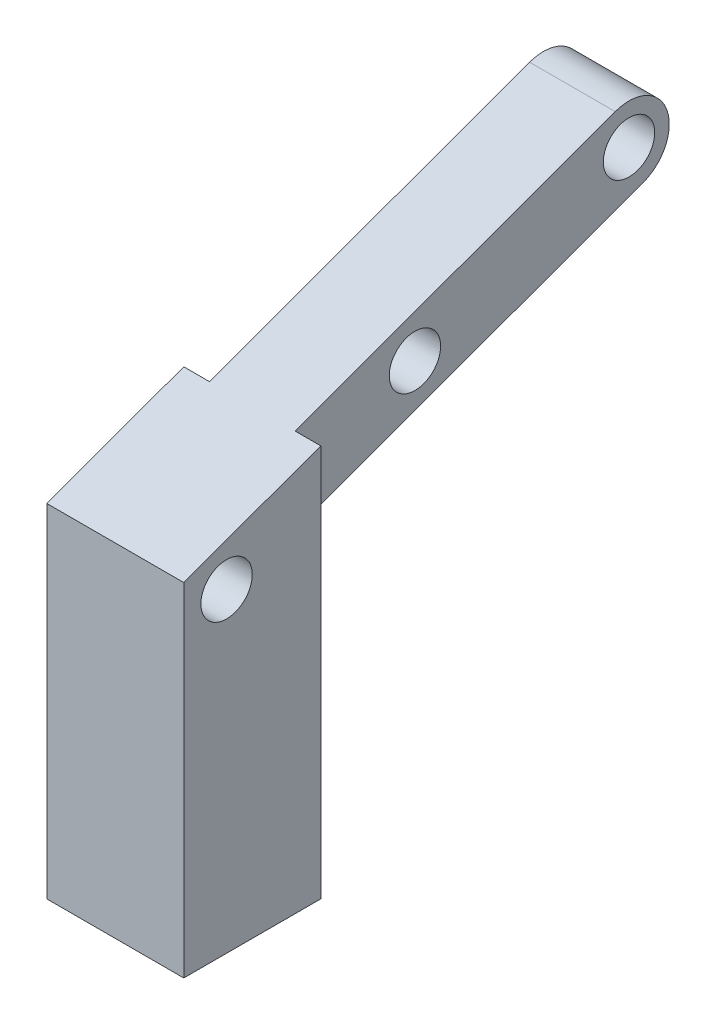
ISO-10303-21;
HEADER;
FILE_DESCRIPTION(('STEP AP214'),'2;1');
FILE_NAME('part.step','',(''),(''),'','','');
FILE_SCHEMA(('AUTOMOTIVE_DESIGN { 1 0 10303 214 1 1 1 1 }'));
ENDSEC;
DATA;
#1=APPLICATION_CONTEXT('core data for automotive mechanical design processes');
#2=APPLICATION_PROTOCOL_DEFINITION('international standard','automotive_design',2000,#1);
#3=PRODUCT_CONTEXT('',#1,'mechanical');
#4=PRODUCT('Part','Part','',(#3));
#5=PRODUCT_RELATED_PRODUCT_CATEGORY('part','',(#4));
#6=PRODUCT_DEFINITION_FORMATION('','',#4);
#7=PRODUCT_DEFINITION_CONTEXT('part definition',#1,'design');
#8=PRODUCT_DEFINITION('design','',#6,#7);
#9=PRODUCT_DEFINITION_SHAPE('','',#8);
#10=(LENGTH_UNIT() NAMED_UNIT(*) SI_UNIT(.MILLI.,.METRE.));
#11=(NAMED_UNIT(*) PLANE_ANGLE_UNIT() SI_UNIT($,.RADIAN.));
#12=(NAMED_UNIT(*) SI_UNIT($,.STERADIAN.) SOLID_ANGLE_UNIT());
#13=UNCERTAINTY_MEASURE_WITH_UNIT(LENGTH_MEASURE(1.E-05),#10,'distance_accuracy_value','');
#14=(GEOMETRIC_REPRESENTATION_CONTEXT(3) GLOBAL_UNCERTAINTY_ASSIGNED_CONTEXT((#13)) GLOBAL_UNIT_ASSIGNED_CONTEXT((#10,
#11,#12)) REPRESENTATION_CONTEXT('',''));
#15=CARTESIAN_POINT('',(0.,0.,0.));
#16=DIRECTION('',(0.,0.,1.));
#17=DIRECTION('',(1.,0.,0.));
#18=AXIS2_PLACEMENT_3D('',#15,#16,#17);
#19=CARTESIAN_POINT('',(2.5,15.,4.));
#20=DIRECTION('',(0.,0.93969262078591,0.342020143325663));
#21=DIRECTION('',(0.,-0.342020143325663,0.939692620785911));
#22=AXIS2_PLACEMENT_3D('',#19,#20,#21);
#23=PLANE('',#22);
#24=DIRECTION('',(-1.,0.,0.));
#25=VECTOR('',#24,1.);
#26=CARTESIAN_POINT('',(4.,25.3016258884216,-24.3034845121082));
#27=LINE('',#26,#25);
#28=CARTESIAN_POINT('',(2.5,25.3016258884216,-24.3034845121082));
#29=VERTEX_POINT('',#28);
#30=CARTESIAN_POINT('',(-2.5,25.3016258884216,-24.3034845121082));
#31=VERTEX_POINT('',#30);
#32=EDGE_CURVE('E226',#29,#31,#27,.T.);
#33=ORIENTED_EDGE('',*,*,#32,.F.);
#34=DIRECTION('',(0.,0.342020143325663,-0.93969262078591));
#35=VECTOR('',#34,1.);
#36=CARTESIAN_POINT('',(2.5,15.,4.));
#37=LINE('',#36,#35);
#38=CARTESIAN_POINT('',(2.5,17.9117618741296,-4.));
#39=VERTEX_POINT('',#38);
#40=EDGE_CURVE('E246',#39,#29,#37,.T.);
#41=ORIENTED_EDGE('',*,*,#40,.F.);
#42=DIRECTION('',(-1.,0.,0.));
#43=VECTOR('',#42,1.);
#44=CARTESIAN_POINT('',(4.,17.9117618741296,-4.));
#45=LINE('',#44,#43);
#46=CARTESIAN_POINT('',(-2.5,17.9117618741296,-4.));
#47=VERTEX_POINT('',#46);
#48=EDGE_CURVE('E50',#39,#47,#45,.T.);
#49=ORIENTED_EDGE('',*,*,#48,.T.);
#50=DIRECTION('',(0.,0.342020143325663,-0.93969262078591));
#51=VECTOR('',#50,1.);
#52=CARTESIAN_POINT('',(-2.5,15.,4.));
#53=LINE('',#52,#51);
#54=EDGE_CURVE('E245',#47,#31,#53,.T.);
#55=ORIENTED_EDGE('',*,*,#54,.T.);
#56=EDGE_LOOP('',(#33,#41,#49,#55));
#57=FACE_BOUND('',#56,.T.);
#58=ADVANCED_FACE('F41',(#57),#23,.F.);
#59=CARTESIAN_POINT('',(2.5,0.,0.));
#60=DIRECTION('',(1.,0.,0.));
#61=DIRECTION('',(0.,0.,-1.));
#62=AXIS2_PLACEMENT_3D('',#59,#60,#61);
#63=PLANE('',#62);
#64=DIRECTION('',(0.,-0.342020143325663,0.93969262078591));
#65=VECTOR('',#64,1.);
#66=CARTESIAN_POINT('',(2.5,20.,4.));
#67=LINE('',#66,#65);
#68=CARTESIAN_POINT('',(2.5,29.7167369962191,-22.6965154878918));
#69=VERTEX_POINT('',#68);
#70=CARTESIAN_POINT('',(2.5,22.9117618741296,-4.));
#71=VERTEX_POINT('',#70);
#72=EDGE_CURVE('E249',#69,#71,#67,.T.);
#73=ORIENTED_EDGE('',*,*,#72,.T.);
#74=DIRECTION('',(0.,1.,0.));
#75=VECTOR('',#74,1.);
#76=CARTESIAN_POINT('',(2.5,20.,-4.));
#77=LINE('',#76,#75);
#78=EDGE_CURVE('E66',#39,#71,#77,.T.);
#79=ORIENTED_EDGE('',*,*,#78,.F.);
#80=ORIENTED_EDGE('',*,*,#40,.T.);
#81=CARTESIAN_POINT('',(2.5,27.5091814423204,-23.5));
#82=DIRECTION('',(1.,0.,0.));
#83=DIRECTION('',(0.,0.,-1.));
#84=AXIS2_PLACEMENT_3D('',#81,#82,#83);
#85=CIRCLE('',#84,2.34923155196478);
#86=EDGE_CURVE('E228',#29,#69,#85,.T.);
#87=ORIENTED_EDGE('',*,*,#86,.T.);
#88=EDGE_LOOP('',(#73,#79,#80,#87));
#89=FACE_BOUND('',#88,.T.);
#90=CARTESIAN_POINT('',(2.5,27.5091814423204,-23.5));
#91=DIRECTION('',(1.,0.,0.));
#92=DIRECTION('',(0.,0.,-1.));
#93=AXIS2_PLACEMENT_3D('',#90,#91,#92);
#94=CIRCLE('',#93,1.5);
#95=CARTESIAN_POINT('',(2.5,27.5091814423204,-25.));
#96=VERTEX_POINT('',#95);
#97=EDGE_CURVE('E242',#96,#96,#94,.T.);
#98=ORIENTED_EDGE('',*,*,#97,.F.);
#99=EDGE_LOOP('',(#98));
#100=FACE_BOUND('',#99,.T.);
#101=CARTESIAN_POINT('',(2.5,22.9595535139929,-11.));
#102=DIRECTION('',(1.,0.,0.));
#103=DIRECTION('',(0.,0.,-1.));
#104=AXIS2_PLACEMENT_3D('',#101,#102,#103);
#105=CIRCLE('',#104,1.5);
#106=CARTESIAN_POINT('',(2.5,22.9595535139929,-12.5));
#107=VERTEX_POINT('',#106);
#108=EDGE_CURVE('E238',#107,#107,#105,.T.);
#109=ORIENTED_EDGE('',*,*,#108,.F.);
#110=EDGE_LOOP('',(#109));
#111=FACE_BOUND('',#110,.T.);
#112=ADVANCED_FACE('F306',(#89,#100,#111),#63,.T.);
#113=CARTESIAN_POINT('',(-2.5,0.,0.));
#114=DIRECTION('',(1.,0.,0.));
#115=DIRECTION('',(0.,0.,-1.));
#116=AXIS2_PLACEMENT_3D('',#113,#114,#115);
#117=PLANE('',#116);
#118=CARTESIAN_POINT('',(-2.5,22.9595535139929,-11.));
#119=DIRECTION('',(1.,0.,0.));
#120=DIRECTION('',(0.,0.,-1.));
#121=AXIS2_PLACEMENT_3D('',#118,#119,#120);
#122=CIRCLE('',#121,1.5);
#123=CARTESIAN_POINT('',(-2.5,22.9595535139929,-12.5));
#124=VERTEX_POINT('',#123);
#125=EDGE_CURVE('E237',#124,#124,#122,.T.);
#126=ORIENTED_EDGE('',*,*,#125,.T.);
#127=EDGE_LOOP('',(#126));
#128=FACE_BOUND('',#127,.T.);
#129=CARTESIAN_POINT('',(-2.5,27.5091814423204,-23.5));
#130=DIRECTION('',(1.,0.,0.));
#131=DIRECTION('',(0.,0.,-1.));
#132=AXIS2_PLACEMENT_3D('',#129,#130,#131);
#133=CIRCLE('',#132,1.5);
#134=CARTESIAN_POINT('',(-2.5,27.5091814423204,-25.));
#135=VERTEX_POINT('',#134);
#136=EDGE_CURVE('E241',#135,#135,#133,.T.);
#137=ORIENTED_EDGE('',*,*,#136,.T.);
#138=EDGE_LOOP('',(#137));
#139=FACE_BOUND('',#138,.T.);
#140=DIRECTION('',(0.,1.,0.));
#141=VECTOR('',#140,1.);
#142=CARTESIAN_POINT('',(-2.5,20.,-4.));
#143=LINE('',#142,#141);
#144=CARTESIAN_POINT('',(-2.5,22.9117618741296,-4.));
#145=VERTEX_POINT('',#144);
#146=EDGE_CURVE('E58',#47,#145,#143,.T.);
#147=ORIENTED_EDGE('',*,*,#146,.T.);
#148=DIRECTION('',(0.,-0.342020143325663,0.93969262078591));
#149=VECTOR('',#148,1.);
#150=CARTESIAN_POINT('',(-2.5,20.,4.));
#151=LINE('',#150,#149);
#152=CARTESIAN_POINT('',(-2.5,29.7167369962191,-22.6965154878918));
#153=VERTEX_POINT('',#152);
#154=EDGE_CURVE('E250',#153,#145,#151,.T.);
#155=ORIENTED_EDGE('',*,*,#154,.F.);
#156=CARTESIAN_POINT('',(-2.5,27.5091814423204,-23.5));
#157=DIRECTION('',(-1.,0.,0.));
#158=DIRECTION('',(0.,0.,1.));
#159=AXIS2_PLACEMENT_3D('',#156,#157,#158);
#160=CIRCLE('',#159,2.34923155196478);
#161=EDGE_CURVE('E221',#153,#31,#160,.T.);
#162=ORIENTED_EDGE('',*,*,#161,.T.);
#163=ORIENTED_EDGE('',*,*,#54,.F.);
#164=EDGE_LOOP('',(#147,#155,#162,#163));
#165=FACE_BOUND('',#164,.T.);
#166=ADVANCED_FACE('F312',(#128,#139,#165),#117,.F.);
#167=CARTESIAN_POINT('',(-4.,20.,4.));
#168=DIRECTION('',(1.,0.,0.));
#169=DIRECTION('',(0.,0.,-1.));
#170=AXIS2_PLACEMENT_3D('',#167,#168,#169);
#171=PLANE('',#170);
#172=CARTESIAN_POINT('',(-4.,18.4099255856655,1.5));
#173=DIRECTION('',(1.,0.,0.));
#174=DIRECTION('',(0.,0.,-1.));
#175=AXIS2_PLACEMENT_3D('',#172,#173,#174);
#176=CIRCLE('',#175,1.5);
#177=CARTESIAN_POINT('',(-4.,18.4099255856655,0.));
#178=VERTEX_POINT('',#177);
#179=EDGE_CURVE('E234',#178,#178,#176,.T.);
#180=ORIENTED_EDGE('',*,*,#179,.T.);
#181=EDGE_LOOP('',(#180));
#182=FACE_BOUND('',#181,.T.);
#183=DIRECTION('',(0.,0.,1.));
#184=VECTOR('',#183,1.);
#185=CARTESIAN_POINT('',(-4.,0.,4.));
#186=LINE('',#185,#184);
#187=CARTESIAN_POINT('',(-4.,0.,-4.));
#188=VERTEX_POINT('',#187);
#189=CARTESIAN_POINT('',(-4.,0.,4.));
#190=VERTEX_POINT('',#189);
#191=EDGE_CURVE('E257',#188,#190,#186,.T.);
#192=ORIENTED_EDGE('',*,*,#191,.T.);
#193=DIRECTION('',(0.,-1.,0.));
#194=VECTOR('',#193,1.);
#195=CARTESIAN_POINT('',(-4.,20.,4.));
#196=LINE('',#195,#194);
#197=CARTESIAN_POINT('',(-4.,20.,4.));
#198=VERTEX_POINT('',#197);
#199=EDGE_CURVE('E277',#198,#190,#196,.T.);
#200=ORIENTED_EDGE('',*,*,#199,.F.);
#201=DIRECTION('',(0.,0.342020143325663,-0.939692620785911));
#202=VECTOR('',#201,1.);
#203=CARTESIAN_POINT('',(-4.,18.9460196505629,6.89578721062732));
#204=LINE('',#203,#202);
#205=CARTESIAN_POINT('',(-4.,22.9117618741296,-4.));
#206=VERTEX_POINT('',#205);
#207=EDGE_CURVE('E214',#198,#206,#204,.T.);
#208=ORIENTED_EDGE('',*,*,#207,.T.);
#209=DIRECTION('',(0.,-1.,0.));
#210=VECTOR('',#209,1.);
#211=CARTESIAN_POINT('',(-4.,20.,-4.));
#212=LINE('',#211,#210);
#213=EDGE_CURVE('E260',#206,#188,#212,.T.);
#214=ORIENTED_EDGE('',*,*,#213,.T.);
#215=EDGE_LOOP('',(#192,#200,#208,#214));
#216=FACE_BOUND('',#215,.T.);
#217=ADVANCED_FACE('F43',(#182,#216),#171,.F.);
#218=CARTESIAN_POINT('',(4.,20.,4.));
#219=DIRECTION('',(0.,0.,-1.));
#220=DIRECTION('',(-1.,0.,0.));
#221=AXIS2_PLACEMENT_3D('',#218,#219,#220);
#222=PLANE('',#221);
#223=DIRECTION('',(0.,-1.,0.));
#224=VECTOR('',#223,1.);
#225=CARTESIAN_POINT('',(4.,20.,4.));
#226=LINE('',#225,#224);
#227=CARTESIAN_POINT('',(4.,20.,4.));
#228=VERTEX_POINT('',#227);
#229=CARTESIAN_POINT('',(4.,0.,4.));
#230=VERTEX_POINT('',#229);
#231=EDGE_CURVE('E274',#228,#230,#226,.T.);
#232=ORIENTED_EDGE('',*,*,#231,.F.);
#233=DIRECTION('',(1.,0.,0.));
#234=VECTOR('',#233,1.);
#235=CARTESIAN_POINT('',(4.,20.,4.));
#236=LINE('',#235,#234);
#237=EDGE_CURVE('E258',#198,#228,#236,.T.);
#238=ORIENTED_EDGE('',*,*,#237,.F.);
#239=ORIENTED_EDGE('',*,*,#199,.T.);
#240=DIRECTION('',(1.,0.,0.));
#241=VECTOR('',#240,1.);
#242=CARTESIAN_POINT('',(4.,0.,4.));
#243=LINE('',#242,#241);
#244=EDGE_CURVE('E264',#190,#230,#243,.T.);
#245=ORIENTED_EDGE('',*,*,#244,.T.);
#246=EDGE_LOOP('',(#232,#238,#239,#245));
#247=FACE_BOUND('',#246,.T.);
#248=ADVANCED_FACE('F329',(#247),#222,.F.);
#249=CARTESIAN_POINT('',(4.,20.,4.));
#250=DIRECTION('',(-1.,0.,0.));
#251=DIRECTION('',(0.,0.,1.));
#252=AXIS2_PLACEMENT_3D('',#249,#250,#251);
#253=PLANE('',#252);
#254=CARTESIAN_POINT('',(4.,18.4099255856655,1.5));
#255=DIRECTION('',(1.,0.,0.));
#256=DIRECTION('',(0.,0.,-1.));
#257=AXIS2_PLACEMENT_3D('',#254,#255,#256);
#258=CIRCLE('',#257,1.5);
#259=CARTESIAN_POINT('',(4.,18.4099255856655,0.));
#260=VERTEX_POINT('',#259);
#261=EDGE_CURVE('E231',#260,#260,#258,.T.);
#262=ORIENTED_EDGE('',*,*,#261,.F.);
#263=EDGE_LOOP('',(#262));
#264=FACE_BOUND('',#263,.T.);
#265=DIRECTION('',(0.,0.,-1.));
#266=VECTOR('',#265,1.);
#267=CARTESIAN_POINT('',(4.,0.,4.));
#268=LINE('',#267,#266);
#269=CARTESIAN_POINT('',(4.,0.,-4.));
#270=VERTEX_POINT('',#269);
#271=EDGE_CURVE('E266',#230,#270,#268,.T.);
#272=ORIENTED_EDGE('',*,*,#271,.T.);
#273=DIRECTION('',(0.,-1.,0.));
#274=VECTOR('',#273,1.);
#275=CARTESIAN_POINT('',(4.,20.,-4.));
#276=LINE('',#275,#274);
#277=CARTESIAN_POINT('',(4.,22.9117618741296,-4.));
#278=VERTEX_POINT('',#277);
#279=EDGE_CURVE('E271',#278,#270,#276,.T.);
#280=ORIENTED_EDGE('',*,*,#279,.F.);
#281=DIRECTION('',(0.,-0.342020143325663,0.939692620785911));
#282=VECTOR('',#281,1.);
#283=CARTESIAN_POINT('',(4.,18.9460196505629,6.89578721062733));
#284=LINE('',#283,#282);
#285=EDGE_CURVE('E207',#278,#228,#284,.T.);
#286=ORIENTED_EDGE('',*,*,#285,.T.);
#287=ORIENTED_EDGE('',*,*,#231,.T.);
#288=EDGE_LOOP('',(#272,#280,#286,#287));
#289=FACE_BOUND('',#288,.T.);
#290=ADVANCED_FACE('F327',(#264,#289),#253,.F.);
#291=CARTESIAN_POINT('',(4.,20.,-4.));
#292=DIRECTION('',(0.,0.,1.));
#293=DIRECTION('',(1.,0.,0.));
#294=AXIS2_PLACEMENT_3D('',#291,#292,#293);
#295=PLANE('',#294);
#296=ORIENTED_EDGE('',*,*,#48,.F.);
#297=ORIENTED_EDGE('',*,*,#78,.T.);
#298=DIRECTION('',(1.,0.,0.));
#299=VECTOR('',#298,1.);
#300=CARTESIAN_POINT('',(-12.5134221798073,22.9117618741296,-4.));
#301=LINE('',#300,#299);
#302=EDGE_CURVE('E210',#71,#278,#301,.T.);
#303=ORIENTED_EDGE('',*,*,#302,.T.);
#304=ORIENTED_EDGE('',*,*,#279,.T.);
#305=DIRECTION('',(-1.,0.,0.));
#306=VECTOR('',#305,1.);
#307=CARTESIAN_POINT('',(4.,0.,-4.));
#308=LINE('',#307,#306);
#309=EDGE_CURVE('E261',#270,#188,#308,.T.);
#310=ORIENTED_EDGE('',*,*,#309,.T.);
#311=ORIENTED_EDGE('',*,*,#213,.F.);
#312=EDGE_CURVE('E211',#206,#145,#301,.T.);
#313=ORIENTED_EDGE('',*,*,#312,.T.);
#314=ORIENTED_EDGE('',*,*,#146,.F.);
#315=EDGE_LOOP('',(#296,#297,#303,#304,#310,#311,#313,#314));
#316=FACE_BOUND('',#315,.T.);
#317=ADVANCED_FACE('F323',(#316),#295,.F.);
#318=CARTESIAN_POINT('',(0.,0.,0.));
#319=DIRECTION('',(0.,1.,0.));
#320=DIRECTION('',(0.,0.,1.));
#321=AXIS2_PLACEMENT_3D('',#318,#319,#320);
#322=PLANE('',#321);
#323=CARTESIAN_POINT('',(0.,0.,0.));
#324=DIRECTION('',(0.,-1.,0.));
#325=DIRECTION('',(0.,0.,-1.));
#326=AXIS2_PLACEMENT_3D('',#323,#324,#325);
#327=CIRCLE('',#326,1.3);
#328=CARTESIAN_POINT('',(0.,0.,-1.3));
#329=VERTEX_POINT('',#328);
#330=EDGE_CURVE('E217',#329,#329,#327,.T.);
#331=ORIENTED_EDGE('',*,*,#330,.F.);
#332=EDGE_LOOP('',(#331));
#333=FACE_BOUND('',#332,.T.);
#334=ORIENTED_EDGE('',*,*,#191,.F.);
#335=ORIENTED_EDGE('',*,*,#309,.F.);
#336=ORIENTED_EDGE('',*,*,#271,.F.);
#337=ORIENTED_EDGE('',*,*,#244,.F.);
#338=EDGE_LOOP('',(#334,#335,#336,#337));
#339=FACE_BOUND('',#338,.T.);
#340=ADVANCED_FACE('F320',(#333,#339),#322,.F.);
#341=CARTESIAN_POINT('',(2.5,20.,4.));
#342=DIRECTION('',(0.,-0.93969262078591,-0.342020143325663));
#343=DIRECTION('',(0.,0.342020143325663,-0.939692620785911));
#344=AXIS2_PLACEMENT_3D('',#341,#342,#343);
#345=PLANE('',#344);
#346=ORIENTED_EDGE('',*,*,#154,.T.);
#347=ORIENTED_EDGE('',*,*,#312,.F.);
#348=ORIENTED_EDGE('',*,*,#207,.F.);
#349=ORIENTED_EDGE('',*,*,#237,.T.);
#350=ORIENTED_EDGE('',*,*,#285,.F.);
#351=ORIENTED_EDGE('',*,*,#302,.F.);
#352=ORIENTED_EDGE('',*,*,#72,.F.);
#353=DIRECTION('',(-1.,0.,0.));
#354=VECTOR('',#353,1.);
#355=CARTESIAN_POINT('',(4.,29.7167369962191,-22.6965154878918));
#356=LINE('',#355,#354);
#357=EDGE_CURVE('E11',#69,#153,#356,.T.);
#358=ORIENTED_EDGE('',*,*,#357,.T.);
#359=EDGE_LOOP('',(#346,#347,#348,#349,#350,#351,#352,#358));
#360=FACE_BOUND('',#359,.T.);
#361=ADVANCED_FACE('F318',(#360),#345,.F.);
#362=CARTESIAN_POINT('',(-4.,22.9595535139929,-11.));
#363=DIRECTION('',(1.,0.,0.));
#364=DIRECTION('',(0.,0.,-1.));
#365=AXIS2_PLACEMENT_3D('',#362,#363,#364);
#366=CYLINDRICAL_SURFACE('',#365,1.5);
#367=CARTESIAN_POINT('',(2.5,22.9595535139929,-12.5));
#368=CARTESIAN_POINT('',(2.44791666666667,22.9595535139929,-12.5));
#369=CARTESIAN_POINT('',(2.39583333333333,22.9595535139929,-12.5));
#370=CARTESIAN_POINT('',(2.29166666666667,22.9595535139929,-12.5));
#371=CARTESIAN_POINT('',(2.23958333333333,22.9595535139929,-12.5));
#372=CARTESIAN_POINT('',(2.13541666666667,22.9595535139929,-12.5));
#373=CARTESIAN_POINT('',(2.08333333333333,22.9595535139929,-12.5));
#374=CARTESIAN_POINT('',(1.97916666666667,22.9595535139929,-12.5));
#375=CARTESIAN_POINT('',(1.92708333333333,22.9595535139929,-12.5));
#376=CARTESIAN_POINT('',(1.82291666666667,22.9595535139929,-12.5));
#377=CARTESIAN_POINT('',(1.77083333333333,22.9595535139929,-12.5));
#378=CARTESIAN_POINT('',(1.66666666666667,22.9595535139929,-12.5));
#379=CARTESIAN_POINT('',(1.61458333333333,22.9595535139929,-12.5));
#380=CARTESIAN_POINT('',(1.51041666666667,22.9595535139929,-12.5));
#381=CARTESIAN_POINT('',(1.45833333333333,22.9595535139929,-12.5));
#382=CARTESIAN_POINT('',(1.35416666666667,22.9595535139929,-12.5));
#383=CARTESIAN_POINT('',(1.30208333333333,22.9595535139929,-12.5));
#384=CARTESIAN_POINT('',(1.19791666666667,22.9595535139929,-12.5));
#385=CARTESIAN_POINT('',(1.14583333333333,22.9595535139929,-12.5));
#386=CARTESIAN_POINT('',(1.04166666666667,22.9595535139929,-12.5));
#387=CARTESIAN_POINT('',(0.989583333333333,22.9595535139929,-12.5));
#388=CARTESIAN_POINT('',(0.885416666666667,22.9595535139929,-12.5));
#389=CARTESIAN_POINT('',(0.833333333333334,22.9595535139929,-12.5));
#390=CARTESIAN_POINT('',(0.729166666666667,22.9595535139929,-12.5));
#391=CARTESIAN_POINT('',(0.677083333333334,22.9595535139929,-12.5));
#392=CARTESIAN_POINT('',(0.572916666666667,22.9595535139929,-12.5));
#393=CARTESIAN_POINT('',(0.520833333333334,22.9595535139929,-12.5));
#394=CARTESIAN_POINT('',(0.416666666666667,22.9595535139929,-12.5));
#395=CARTESIAN_POINT('',(0.364583333333334,22.9595535139929,-12.5));
#396=CARTESIAN_POINT('',(0.260416666666667,22.9595535139929,-12.5));
#397=CARTESIAN_POINT('',(0.208333333333334,22.9595535139929,-12.5));
#398=CARTESIAN_POINT('',(0.104166666666667,22.9595535139929,-12.5));
#399=CARTESIAN_POINT('',(0.0520833333333334,22.9595535139929,-12.5));
#400=CARTESIAN_POINT('',(-0.0520833333333334,22.9595535139929,-12.5));
#401=CARTESIAN_POINT('',(-0.104166666666667,22.9595535139929,-12.5));
#402=CARTESIAN_POINT('',(-0.208333333333334,22.9595535139929,-12.5));
#403=CARTESIAN_POINT('',(-0.260416666666667,22.9595535139929,-12.5));
#404=CARTESIAN_POINT('',(-0.364583333333334,22.9595535139929,-12.5));
#405=CARTESIAN_POINT('',(-0.416666666666667,22.9595535139929,-12.5));
#406=CARTESIAN_POINT('',(-0.520833333333333,22.9595535139929,-12.5));
#407=CARTESIAN_POINT('',(-0.572916666666667,22.9595535139929,-12.5));
#408=CARTESIAN_POINT('',(-0.677083333333333,22.9595535139929,-12.5));
#409=CARTESIAN_POINT('',(-0.729166666666667,22.9595535139929,-12.5));
#410=CARTESIAN_POINT('',(-0.833333333333333,22.9595535139929,-12.5));
#411=CARTESIAN_POINT('',(-0.885416666666667,22.9595535139929,-12.5));
#412=CARTESIAN_POINT('',(-0.989583333333333,22.9595535139929,-12.5));
#413=CARTESIAN_POINT('',(-1.04166666666667,22.9595535139929,-12.5));
#414=CARTESIAN_POINT('',(-1.14583333333333,22.9595535139929,-12.5));
#415=CARTESIAN_POINT('',(-1.19791666666667,22.9595535139929,-12.5));
#416=CARTESIAN_POINT('',(-1.30208333333333,22.9595535139929,-12.5));
#417=CARTESIAN_POINT('',(-1.35416666666667,22.9595535139929,-12.5));
#418=CARTESIAN_POINT('',(-1.45833333333333,22.9595535139929,-12.5));
#419=CARTESIAN_POINT('',(-1.51041666666667,22.9595535139929,-12.5));
#420=CARTESIAN_POINT('',(-1.61458333333333,22.9595535139929,-12.5));
#421=CARTESIAN_POINT('',(-1.66666666666667,22.9595535139929,-12.5));
#422=CARTESIAN_POINT('',(-1.77083333333333,22.9595535139929,-12.5));
#423=CARTESIAN_POINT('',(-1.82291666666667,22.9595535139929,-12.5));
#424=CARTESIAN_POINT('',(-1.92708333333333,22.9595535139929,-12.5));
#425=CARTESIAN_POINT('',(-1.97916666666667,22.9595535139929,-12.5));
#426=CARTESIAN_POINT('',(-2.08333333333333,22.9595535139929,-12.5));
#427=CARTESIAN_POINT('',(-2.13541666666667,22.9595535139929,-12.5));
#428=CARTESIAN_POINT('',(-2.23958333333333,22.9595535139929,-12.5));
#429=CARTESIAN_POINT('',(-2.29166666666667,22.9595535139929,-12.5));
#430=CARTESIAN_POINT('',(-2.39583333333333,22.9595535139929,-12.5));
#431=CARTESIAN_POINT('',(-2.44791666666667,22.9595535139929,-12.5));
#432=CARTESIAN_POINT('',(-2.5,22.9595535139929,-12.5));
#433=B_SPLINE_CURVE_WITH_KNOTS('',3,(#367,#368,#369,#370,#371,#372,#373,#374,#375,#376,#377,
#378,#379,#380,#381,#382,#383,#384,#385,#386,#387,#388,#389,#390,#391,#392,#393,#394,#395,#396,
#397,#398,#399,#400,#401,#402,#403,#404,#405,#406,#407,#408,#409,#410,#411,#412,#413,#414,#415,
#416,#417,#418,#419,#420,#421,#422,#423,#424,#425,#426,#427,#428,#429,#430,#431,#432),
.UNSPECIFIED.,.F.,.F.,(4,2,2,2,2,2,2,2,2,2,2,2,2,2,2,2,2,2,2,2,2,2,2,2,2,2,2,2,2,2,2,2,4),(0.,
0.15625,0.3125,0.46875,0.625000000000001,0.78125,0.9375,1.09375,1.25,1.40625,1.5625,1.71875,
1.875,2.03125,2.1875,2.34375,2.5,2.65625,2.8125,2.96875,3.125,3.28125,3.4375,3.59375,3.75,
3.90625,4.0625,4.21875,4.375,4.53125,4.6875,4.84375,5.),.UNSPECIFIED.);
#434=EDGE_CURVE('BSEAM358',#107,#124,#433,.T.);
#435=ORIENTED_EDGE('',*,*,#108,.T.);
#436=ORIENTED_EDGE('',*,*,#125,.F.);
#437=ORIENTED_EDGE('',*,*,#434,.T.);
#438=ORIENTED_EDGE('',*,*,#434,.F.);
#439=EDGE_LOOP('',(#435,#437,#436,#438));
#440=FACE_BOUND('',#439,.T.);
#441=ADVANCED_FACE('F358',(#440),#366,.F.);
#442=CARTESIAN_POINT('',(-4.,27.5091814423204,-23.5));
#443=DIRECTION('',(1.,0.,0.));
#444=DIRECTION('',(0.,0.,-1.));
#445=AXIS2_PLACEMENT_3D('',#442,#443,#444);
#446=CYLINDRICAL_SURFACE('',#445,1.5);
#447=CARTESIAN_POINT('',(2.5,27.5091814423204,-25.));
#448=CARTESIAN_POINT('',(2.44791666666667,27.5091814423204,-25.));
#449=CARTESIAN_POINT('',(2.39583333333333,27.5091814423204,-25.));
#450=CARTESIAN_POINT('',(2.29166666666667,27.5091814423204,-25.));
#451=CARTESIAN_POINT('',(2.23958333333333,27.5091814423204,-25.));
#452=CARTESIAN_POINT('',(2.13541666666667,27.5091814423204,-25.));
#453=CARTESIAN_POINT('',(2.08333333333333,27.5091814423204,-25.));
#454=CARTESIAN_POINT('',(1.97916666666667,27.5091814423204,-25.));
#455=CARTESIAN_POINT('',(1.92708333333333,27.5091814423204,-25.));
#456=CARTESIAN_POINT('',(1.82291666666667,27.5091814423204,-25.));
#457=CARTESIAN_POINT('',(1.77083333333333,27.5091814423204,-25.));
#458=CARTESIAN_POINT('',(1.66666666666667,27.5091814423204,-25.));
#459=CARTESIAN_POINT('',(1.61458333333333,27.5091814423204,-25.));
#460=CARTESIAN_POINT('',(1.51041666666667,27.5091814423204,-25.));
#461=CARTESIAN_POINT('',(1.45833333333333,27.5091814423204,-25.));
#462=CARTESIAN_POINT('',(1.35416666666667,27.5091814423204,-25.));
#463=CARTESIAN_POINT('',(1.30208333333333,27.5091814423204,-25.));
#464=CARTESIAN_POINT('',(1.19791666666667,27.5091814423204,-25.));
#465=CARTESIAN_POINT('',(1.14583333333333,27.5091814423204,-25.));
#466=CARTESIAN_POINT('',(1.04166666666667,27.5091814423204,-25.));
#467=CARTESIAN_POINT('',(0.989583333333333,27.5091814423204,-25.));
#468=CARTESIAN_POINT('',(0.885416666666667,27.5091814423204,-25.));
#469=CARTESIAN_POINT('',(0.833333333333334,27.5091814423204,-25.));
#470=CARTESIAN_POINT('',(0.729166666666667,27.5091814423204,-25.));
#471=CARTESIAN_POINT('',(0.677083333333334,27.5091814423204,-25.));
#472=CARTESIAN_POINT('',(0.572916666666667,27.5091814423204,-25.));
#473=CARTESIAN_POINT('',(0.520833333333334,27.5091814423204,-25.));
#474=CARTESIAN_POINT('',(0.416666666666667,27.5091814423204,-25.));
#475=CARTESIAN_POINT('',(0.364583333333334,27.5091814423204,-25.));
#476=CARTESIAN_POINT('',(0.260416666666667,27.5091814423204,-25.));
#477=CARTESIAN_POINT('',(0.208333333333334,27.5091814423204,-25.));
#478=CARTESIAN_POINT('',(0.104166666666667,27.5091814423204,-25.));
#479=CARTESIAN_POINT('',(0.0520833333333334,27.5091814423204,-25.));
#480=CARTESIAN_POINT('',(-0.0520833333333334,27.5091814423204,-25.));
#481=CARTESIAN_POINT('',(-0.104166666666667,27.5091814423204,-25.));
#482=CARTESIAN_POINT('',(-0.208333333333334,27.5091814423204,-25.));
#483=CARTESIAN_POINT('',(-0.260416666666667,27.5091814423204,-25.));
#484=CARTESIAN_POINT('',(-0.364583333333334,27.5091814423204,-25.));
#485=CARTESIAN_POINT('',(-0.416666666666667,27.5091814423204,-25.));
#486=CARTESIAN_POINT('',(-0.520833333333333,27.5091814423204,-25.));
#487=CARTESIAN_POINT('',(-0.572916666666667,27.5091814423204,-25.));
#488=CARTESIAN_POINT('',(-0.677083333333333,27.5091814423204,-25.));
#489=CARTESIAN_POINT('',(-0.729166666666667,27.5091814423204,-25.));
#490=CARTESIAN_POINT('',(-0.833333333333333,27.5091814423204,-25.));
#491=CARTESIAN_POINT('',(-0.885416666666667,27.5091814423204,-25.));
#492=CARTESIAN_POINT('',(-0.989583333333333,27.5091814423204,-25.));
#493=CARTESIAN_POINT('',(-1.04166666666667,27.5091814423204,-25.));
#494=CARTESIAN_POINT('',(-1.14583333333333,27.5091814423204,-25.));
#495=CARTESIAN_POINT('',(-1.19791666666667,27.5091814423204,-25.));
#496=CARTESIAN_POINT('',(-1.30208333333333,27.5091814423204,-25.));
#497=CARTESIAN_POINT('',(-1.35416666666667,27.5091814423204,-25.));
#498=CARTESIAN_POINT('',(-1.45833333333333,27.5091814423204,-25.));
#499=CARTESIAN_POINT('',(-1.51041666666667,27.5091814423204,-25.));
#500=CARTESIAN_POINT('',(-1.61458333333333,27.5091814423204,-25.));
#501=CARTESIAN_POINT('',(-1.66666666666667,27.5091814423204,-25.));
#502=CARTESIAN_POINT('',(-1.77083333333333,27.5091814423204,-25.));
#503=CARTESIAN_POINT('',(-1.82291666666667,27.5091814423204,-25.));
#504=CARTESIAN_POINT('',(-1.92708333333333,27.5091814423204,-25.));
#505=CARTESIAN_POINT('',(-1.97916666666667,27.5091814423204,-25.));
#506=CARTESIAN_POINT('',(-2.08333333333333,27.5091814423204,-25.));
#507=CARTESIAN_POINT('',(-2.13541666666667,27.5091814423204,-25.));
#508=CARTESIAN_POINT('',(-2.23958333333333,27.5091814423204,-25.));
#509=CARTESIAN_POINT('',(-2.29166666666667,27.5091814423204,-25.));
#510=CARTESIAN_POINT('',(-2.39583333333333,27.5091814423204,-25.));
#511=CARTESIAN_POINT('',(-2.44791666666667,27.5091814423204,-25.));
#512=CARTESIAN_POINT('',(-2.5,27.5091814423204,-25.));
#513=B_SPLINE_CURVE_WITH_KNOTS('',3,(#447,#448,#449,#450,#451,#452,#453,#454,#455,#456,#457,
#458,#459,#460,#461,#462,#463,#464,#465,#466,#467,#468,#469,#470,#471,#472,#473,#474,#475,#476,
#477,#478,#479,#480,#481,#482,#483,#484,#485,#486,#487,#488,#489,#490,#491,#492,#493,#494,#495,
#496,#497,#498,#499,#500,#501,#502,#503,#504,#505,#506,#507,#508,#509,#510,#511,#512),
.UNSPECIFIED.,.F.,.F.,(4,2,2,2,2,2,2,2,2,2,2,2,2,2,2,2,2,2,2,2,2,2,2,2,2,2,2,2,2,2,2,2,4),(0.,
0.15625,0.3125,0.46875,0.625000000000001,0.78125,0.9375,1.09375,1.25,1.40625,1.5625,1.71875,
1.875,2.03125,2.1875,2.34375,2.5,2.65625,2.8125,2.96875,3.125,3.28125,3.4375,3.59375,3.75,
3.90625,4.0625,4.21875,4.375,4.53125,4.6875,4.84375,5.),.UNSPECIFIED.);
#514=EDGE_CURVE('BSEAM361',#96,#135,#513,.T.);
#515=ORIENTED_EDGE('',*,*,#97,.T.);
#516=ORIENTED_EDGE('',*,*,#136,.F.);
#517=ORIENTED_EDGE('',*,*,#514,.T.);
#518=ORIENTED_EDGE('',*,*,#514,.F.);
#519=EDGE_LOOP('',(#515,#517,#516,#518));
#520=FACE_BOUND('',#519,.T.);
#521=ADVANCED_FACE('F361',(#520),#446,.F.);
#522=CARTESIAN_POINT('',(-4.,18.4099255856655,1.5));
#523=DIRECTION('',(1.,0.,0.));
#524=DIRECTION('',(0.,0.,-1.));
#525=AXIS2_PLACEMENT_3D('',#522,#523,#524);
#526=CYLINDRICAL_SURFACE('',#525,1.5);
#527=ORIENTED_EDGE('',*,*,#179,.F.);
#528=EDGE_LOOP('',(#527));
#529=FACE_BOUND('',#528,.T.);
#530=ORIENTED_EDGE('',*,*,#261,.T.);
#531=EDGE_LOOP('',(#530));
#532=FACE_BOUND('',#531,.T.);
#533=ADVANCED_FACE('F370',(#529,#532),#526,.F.);
#534=CARTESIAN_POINT('',(4.,27.5091814423204,-23.5));
#535=DIRECTION('',(-1.,0.,0.));
#536=DIRECTION('',(0.,0.,1.));
#537=AXIS2_PLACEMENT_3D('',#534,#535,#536);
#538=CYLINDRICAL_SURFACE('',#537,2.34923155196478);
#539=ORIENTED_EDGE('',*,*,#32,.T.);
#540=ORIENTED_EDGE('',*,*,#161,.F.);
#541=ORIENTED_EDGE('',*,*,#357,.F.);
#542=ORIENTED_EDGE('',*,*,#86,.F.);
#543=EDGE_LOOP('',(#539,#540,#541,#542));
#544=FACE_BOUND('',#543,.T.);
#545=ADVANCED_FACE('F304',(#544),#538,.T.);
#546=CARTESIAN_POINT('',(0.,10.,0.));
#547=DIRECTION('',(0.,-1.,0.));
#548=DIRECTION('',(0.,0.,-1.));
#549=AXIS2_PLACEMENT_3D('',#546,#547,#548);
#550=CYLINDRICAL_SURFACE('',#549,1.3);
#551=CARTESIAN_POINT('',(0.,4.,0.));
#552=DIRECTION('',(0.,-1.,0.));
#553=DIRECTION('',(0.,0.,-1.));
#554=AXIS2_PLACEMENT_3D('',#551,#552,#553);
#555=CIRCLE('',#554,1.3);
#556=CARTESIAN_POINT('',(0.,4.,-1.3));
#557=VERTEX_POINT('',#556);
#558=EDGE_CURVE('E199',#557,#557,#555,.F.);
#559=ORIENTED_EDGE('',*,*,#558,.T.);
#560=EDGE_LOOP('',(#559));
#561=FACE_BOUND('',#560,.T.);
#562=ORIENTED_EDGE('',*,*,#330,.T.);
#563=EDGE_LOOP('',(#562));
#564=FACE_BOUND('',#563,.T.);
#565=ADVANCED_FACE('F295',(#561,#564),#550,.F.);
#566=CARTESIAN_POINT('',(0.,7.55,0.));
#567=DIRECTION('',(0.,-1.,0.));
#568=DIRECTION('',(0.,0.,-1.));
#569=AXIS2_PLACEMENT_3D('',#566,#567,#568);
#570=PLANE('',#569);
#571=DIRECTION('',(0.5,0.,0.866025403784439));
#572=VECTOR('',#571,1.);
#573=CARTESIAN_POINT('',(1.42028166220648,7.55,-2.46));
#574=LINE('',#573,#572);
#575=CARTESIAN_POINT('',(1.42028166220648,7.55,-2.46));
#576=VERTEX_POINT('',#575);
#577=CARTESIAN_POINT('',(2.84056332441296,7.55,0.));
#578=VERTEX_POINT('',#577);
#579=EDGE_CURVE('E151',#576,#578,#574,.T.);
#580=ORIENTED_EDGE('',*,*,#579,.T.);
#581=DIRECTION('',(-0.5,0.,0.866025403784438));
#582=VECTOR('',#581,1.);
#583=CARTESIAN_POINT('',(2.84056332441296,7.55,0.));
#584=LINE('',#583,#582);
#585=CARTESIAN_POINT('',(1.42028166220648,7.55,2.46));
#586=VERTEX_POINT('',#585);
#587=EDGE_CURVE('E162',#578,#586,#584,.T.);
#588=ORIENTED_EDGE('',*,*,#587,.T.);
#589=DIRECTION('',(-1.,0.,0.));
#590=VECTOR('',#589,1.);
#591=CARTESIAN_POINT('',(1.42028166220648,7.55,2.46));
#592=LINE('',#591,#590);
#593=CARTESIAN_POINT('',(-1.42028166220648,7.55,2.46));
#594=VERTEX_POINT('',#593);
#595=EDGE_CURVE('E167',#586,#594,#592,.T.);
#596=ORIENTED_EDGE('',*,*,#595,.T.);
#597=DIRECTION('',(-0.5,0.,-0.866025403784439));
#598=VECTOR('',#597,1.);
#599=CARTESIAN_POINT('',(-1.42028166220648,7.55,2.46));
#600=LINE('',#599,#598);
#601=CARTESIAN_POINT('',(-2.84056332441296,7.55,0.));
#602=VERTEX_POINT('',#601);
#603=EDGE_CURVE('E180',#594,#602,#600,.T.);
#604=ORIENTED_EDGE('',*,*,#603,.T.);
#605=DIRECTION('',(0.5,0.,-0.866025403784439));
#606=VECTOR('',#605,1.);
#607=CARTESIAN_POINT('',(-2.84056332441296,7.55,0.));
#608=LINE('',#607,#606);
#609=CARTESIAN_POINT('',(-1.42028166220648,7.55,-2.46));
#610=VERTEX_POINT('',#609);
#611=EDGE_CURVE('E183',#602,#610,#608,.T.);
#612=ORIENTED_EDGE('',*,*,#611,.T.);
#613=DIRECTION('',(1.,0.,0.));
#614=VECTOR('',#613,1.);
#615=CARTESIAN_POINT('',(-1.42028166220648,7.55,-2.46));
#616=LINE('',#615,#614);
#617=EDGE_CURVE('E159',#610,#576,#616,.T.);
#618=ORIENTED_EDGE('',*,*,#617,.T.);
#619=EDGE_LOOP('',(#580,#588,#596,#604,#612,#618));
#620=FACE_BOUND('',#619,.T.);
#621=CARTESIAN_POINT('',(0.,7.55,0.));
#622=DIRECTION('',(0.,-1.,0.));
#623=DIRECTION('',(0.,0.,-1.));
#624=AXIS2_PLACEMENT_3D('',#621,#622,#623);
#625=CIRCLE('',#624,1.3);
#626=CARTESIAN_POINT('',(0.,7.55,-1.3));
#627=VERTEX_POINT('',#626);
#628=EDGE_CURVE('E45',#627,#627,#625,.F.);
#629=ORIENTED_EDGE('',*,*,#628,.T.);
#630=EDGE_LOOP('',(#629));
#631=FACE_BOUND('',#630,.T.);
#632=ADVANCED_FACE('F169',(#620,#631),#570,.T.);
#633=CARTESIAN_POINT('',(0.,4.,0.));
#634=DIRECTION('',(0.,-1.,0.));
#635=DIRECTION('',(0.,0.,-1.));
#636=AXIS2_PLACEMENT_3D('',#633,#634,#635);
#637=PLANE('',#636);
#638=DIRECTION('',(0.5,0.,0.866025403784439));
#639=VECTOR('',#638,1.);
#640=CARTESIAN_POINT('',(1.42028166220648,4.,-2.46));
#641=LINE('',#640,#639);
#642=CARTESIAN_POINT('',(1.42028166220648,4.,-2.46));
#643=VERTEX_POINT('',#642);
#644=CARTESIAN_POINT('',(2.84056332441296,4.,0.));
#645=VERTEX_POINT('',#644);
#646=EDGE_CURVE('E154',#643,#645,#641,.T.);
#647=ORIENTED_EDGE('',*,*,#646,.F.);
#648=DIRECTION('',(1.,0.,0.));
#649=VECTOR('',#648,1.);
#650=CARTESIAN_POINT('',(-1.42028166220648,4.,-2.46));
#651=LINE('',#650,#649);
#652=CARTESIAN_POINT('',(-1.42028166220648,4.,-2.46));
#653=VERTEX_POINT('',#652);
#654=EDGE_CURVE('E173',#653,#643,#651,.T.);
#655=ORIENTED_EDGE('',*,*,#654,.F.);
#656=DIRECTION('',(0.5,0.,-0.866025403784439));
#657=VECTOR('',#656,1.);
#658=CARTESIAN_POINT('',(-2.84056332441296,4.,0.));
#659=LINE('',#658,#657);
#660=CARTESIAN_POINT('',(-2.84056332441296,4.,0.));
#661=VERTEX_POINT('',#660);
#662=EDGE_CURVE('E176',#661,#653,#659,.T.);
#663=ORIENTED_EDGE('',*,*,#662,.F.);
#664=DIRECTION('',(-0.5,0.,-0.866025403784439));
#665=VECTOR('',#664,1.);
#666=CARTESIAN_POINT('',(-1.42028166220648,4.,2.46));
#667=LINE('',#666,#665);
#668=CARTESIAN_POINT('',(-1.42028166220648,4.,2.46));
#669=VERTEX_POINT('',#668);
#670=EDGE_CURVE('E192',#669,#661,#667,.T.);
#671=ORIENTED_EDGE('',*,*,#670,.F.);
#672=DIRECTION('',(-1.,0.,0.));
#673=VECTOR('',#672,1.);
#674=CARTESIAN_POINT('',(1.42028166220648,4.,2.46));
#675=LINE('',#674,#673);
#676=CARTESIAN_POINT('',(1.42028166220648,4.,2.46));
#677=VERTEX_POINT('',#676);
#678=EDGE_CURVE('E189',#677,#669,#675,.T.);
#679=ORIENTED_EDGE('',*,*,#678,.F.);
#680=DIRECTION('',(-0.5,0.,0.866025403784438));
#681=VECTOR('',#680,1.);
#682=CARTESIAN_POINT('',(2.84056332441296,4.,0.));
#683=LINE('',#682,#681);
#684=EDGE_CURVE('E187',#645,#677,#683,.T.);
#685=ORIENTED_EDGE('',*,*,#684,.F.);
#686=EDGE_LOOP('',(#647,#655,#663,#671,#679,#685));
#687=FACE_BOUND('',#686,.T.);
#688=ORIENTED_EDGE('',*,*,#558,.F.);
#689=EDGE_LOOP('',(#688));
#690=FACE_BOUND('',#689,.T.);
#691=ADVANCED_FACE('F395',(#687,#690),#637,.F.);
#692=CARTESIAN_POINT('',(1.42028166220648,7.55,-2.46));
#693=DIRECTION('',(0.866025403784439,0.,-0.5));
#694=DIRECTION('',(-0.5,0.,-0.866025403784439));
#695=AXIS2_PLACEMENT_3D('',#692,#693,#694);
#696=PLANE('',#695);
#697=ORIENTED_EDGE('',*,*,#646,.T.);
#698=DIRECTION('',(0.,-1.,0.));
#699=VECTOR('',#698,1.);
#700=CARTESIAN_POINT('',(2.84056332441296,7.55,0.));
#701=LINE('',#700,#699);
#702=EDGE_CURVE('E147',#578,#645,#701,.T.);
#703=ORIENTED_EDGE('',*,*,#702,.F.);
#704=ORIENTED_EDGE('',*,*,#579,.F.);
#705=DIRECTION('',(0.,-1.,0.));
#706=VECTOR('',#705,1.);
#707=CARTESIAN_POINT('',(1.42028166220648,7.55,-2.46));
#708=LINE('',#707,#706);
#709=EDGE_CURVE('E197',#576,#643,#708,.T.);
#710=ORIENTED_EDGE('',*,*,#709,.T.);
#711=EDGE_LOOP('',(#697,#703,#704,#710));
#712=FACE_BOUND('',#711,.T.);
#713=ADVANCED_FACE('F149',(#712),#696,.F.);
#714=CARTESIAN_POINT('',(-1.42028166220648,7.55,-2.46));
#715=DIRECTION('',(0.,0.,-1.));
#716=DIRECTION('',(-1.,0.,0.));
#717=AXIS2_PLACEMENT_3D('',#714,#715,#716);
#718=PLANE('',#717);
#719=ORIENTED_EDGE('',*,*,#654,.T.);
#720=ORIENTED_EDGE('',*,*,#709,.F.);
#721=ORIENTED_EDGE('',*,*,#617,.F.);
#722=DIRECTION('',(0.,-1.,0.));
#723=VECTOR('',#722,1.);
#724=CARTESIAN_POINT('',(-1.42028166220648,7.55,-2.46));
#725=LINE('',#724,#723);
#726=EDGE_CURVE('E200',#610,#653,#725,.T.);
#727=ORIENTED_EDGE('',*,*,#726,.T.);
#728=EDGE_LOOP('',(#719,#720,#721,#727));
#729=FACE_BOUND('',#728,.T.);
#730=ADVANCED_FACE('F409',(#729),#718,.F.);
#731=CARTESIAN_POINT('',(-2.84056332441296,7.55,0.));
#732=DIRECTION('',(-0.866025403784438,0.,-0.5));
#733=DIRECTION('',(-0.5,0.,0.866025403784439));
#734=AXIS2_PLACEMENT_3D('',#731,#732,#733);
#735=PLANE('',#734);
#736=ORIENTED_EDGE('',*,*,#662,.T.);
#737=ORIENTED_EDGE('',*,*,#726,.F.);
#738=ORIENTED_EDGE('',*,*,#611,.F.);
#739=DIRECTION('',(0.,-1.,0.));
#740=VECTOR('',#739,1.);
#741=CARTESIAN_POINT('',(-2.84056332441296,7.55,0.));
#742=LINE('',#741,#740);
#743=EDGE_CURVE('E202',#602,#661,#742,.T.);
#744=ORIENTED_EDGE('',*,*,#743,.T.);
#745=EDGE_LOOP('',(#736,#737,#738,#744));
#746=FACE_BOUND('',#745,.T.);
#747=ADVANCED_FACE('F416',(#746),#735,.F.);
#748=CARTESIAN_POINT('',(-1.42028166220648,7.55,2.46));
#749=DIRECTION('',(-0.866025403784439,0.,0.5));
#750=DIRECTION('',(0.5,0.,0.866025403784439));
#751=AXIS2_PLACEMENT_3D('',#748,#749,#750);
#752=PLANE('',#751);
#753=ORIENTED_EDGE('',*,*,#670,.T.);
#754=ORIENTED_EDGE('',*,*,#743,.F.);
#755=ORIENTED_EDGE('',*,*,#603,.F.);
#756=DIRECTION('',(0.,-1.,0.));
#757=VECTOR('',#756,1.);
#758=CARTESIAN_POINT('',(-1.42028166220648,7.55,2.46));
#759=LINE('',#758,#757);
#760=EDGE_CURVE('E204',#594,#669,#759,.T.);
#761=ORIENTED_EDGE('',*,*,#760,.T.);
#762=EDGE_LOOP('',(#753,#754,#755,#761));
#763=FACE_BOUND('',#762,.T.);
#764=ADVANCED_FACE('F424',(#763),#752,.F.);
#765=CARTESIAN_POINT('',(1.42028166220648,7.55,2.46));
#766=DIRECTION('',(0.,0.,1.));
#767=DIRECTION('',(1.,0.,0.));
#768=AXIS2_PLACEMENT_3D('',#765,#766,#767);
#769=PLANE('',#768);
#770=ORIENTED_EDGE('',*,*,#678,.T.);
#771=ORIENTED_EDGE('',*,*,#760,.F.);
#772=ORIENTED_EDGE('',*,*,#595,.F.);
#773=DIRECTION('',(0.,-1.,0.));
#774=VECTOR('',#773,1.);
#775=CARTESIAN_POINT('',(1.42028166220648,7.55,2.46));
#776=LINE('',#775,#774);
#777=EDGE_CURVE('E158',#586,#677,#776,.T.);
#778=ORIENTED_EDGE('',*,*,#777,.T.);
#779=EDGE_LOOP('',(#770,#771,#772,#778));
#780=FACE_BOUND('',#779,.T.);
#781=ADVANCED_FACE('F432',(#780),#769,.F.);
#782=CARTESIAN_POINT('',(2.84056332441296,7.55,0.));
#783=DIRECTION('',(0.866025403784438,0.,0.5));
#784=DIRECTION('',(0.5,0.,-0.866025403784439));
#785=AXIS2_PLACEMENT_3D('',#782,#783,#784);
#786=PLANE('',#785);
#787=ORIENTED_EDGE('',*,*,#684,.T.);
#788=ORIENTED_EDGE('',*,*,#777,.F.);
#789=ORIENTED_EDGE('',*,*,#587,.F.);
#790=ORIENTED_EDGE('',*,*,#702,.T.);
#791=EDGE_LOOP('',(#787,#788,#789,#790));
#792=FACE_BOUND('',#791,.T.);
#793=ADVANCED_FACE('F163',(#792),#786,.F.);
#794=CARTESIAN_POINT('',(0.,10.,0.));
#795=DIRECTION('',(0.,-1.,0.));
#796=DIRECTION('',(0.,0.,-1.));
#797=AXIS2_PLACEMENT_3D('',#794,#795,#796);
#798=PLANE('',#797);
#799=CARTESIAN_POINT('',(0.,10.,0.));
#800=DIRECTION('',(0.,-1.,0.));
#801=DIRECTION('',(0.,0.,-1.));
#802=AXIS2_PLACEMENT_3D('',#799,#800,#801);
#803=CIRCLE('',#802,1.3);
#804=CARTESIAN_POINT('',(0.,10.,-1.3));
#805=VERTEX_POINT('',#804);
#806=EDGE_CURVE('E218',#805,#805,#803,.T.);
#807=ORIENTED_EDGE('',*,*,#806,.T.);
#808=EDGE_LOOP('',(#807));
#809=FACE_BOUND('',#808,.T.);
#810=ADVANCED_FACE('F292',(#809),#798,.T.);
#811=ORIENTED_EDGE('',*,*,#806,.F.);
#812=EDGE_LOOP('',(#811));
#813=FACE_BOUND('',#812,.T.);
#814=ORIENTED_EDGE('',*,*,#628,.F.);
#815=EDGE_LOOP('',(#814));
#816=FACE_BOUND('',#815,.T.);
#817=ADVANCED_FACE('F290',(#813,#816),#550,.F.);
#818=CLOSED_SHELL('',(#58,#112,#166,#217,#248,#290,#317,#340,#361,#441,#521,#533,#545,#565,#632,
#691,#713,#730,#747,#764,#781,#793,#810,#817));
#819=MANIFOLD_SOLID_BREP('B2',#818);
#820=ADVANCED_BREP_SHAPE_REPRESENTATION('',(#18,#819),#14);
#821=SHAPE_DEFINITION_REPRESENTATION(#9,#820);
ENDSEC;
END-ISO-10303-21;
